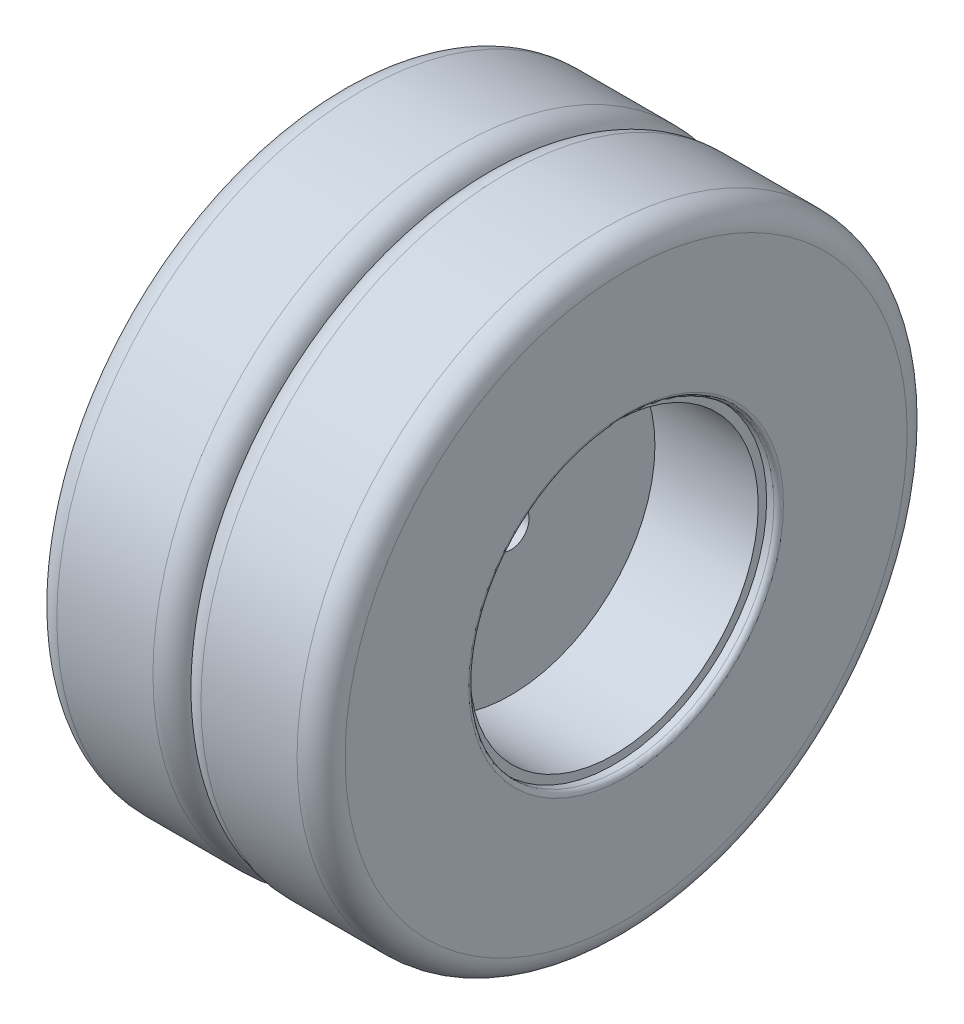
ISO-10303-21;
HEADER;
FILE_DESCRIPTION(('STEP AP214'),'2;1');
FILE_NAME('part.step','',(''),(''),'','','');
FILE_SCHEMA(('AUTOMOTIVE_DESIGN { 1 0 10303 214 1 1 1 1 }'));
ENDSEC;
DATA;
#1=APPLICATION_CONTEXT('core data for automotive mechanical design processes');
#2=APPLICATION_PROTOCOL_DEFINITION('international standard','automotive_design',2000,#1);
#3=PRODUCT_CONTEXT('',#1,'mechanical');
#4=PRODUCT('Part','Part','',(#3));
#5=PRODUCT_RELATED_PRODUCT_CATEGORY('part','',(#4));
#6=PRODUCT_DEFINITION_FORMATION('','',#4);
#7=PRODUCT_DEFINITION_CONTEXT('part definition',#1,'design');
#8=PRODUCT_DEFINITION('design','',#6,#7);
#9=PRODUCT_DEFINITION_SHAPE('','',#8);
#10=(LENGTH_UNIT() NAMED_UNIT(*) SI_UNIT(.MILLI.,.METRE.));
#11=(NAMED_UNIT(*) PLANE_ANGLE_UNIT() SI_UNIT($,.RADIAN.));
#12=(NAMED_UNIT(*) SI_UNIT($,.STERADIAN.) SOLID_ANGLE_UNIT());
#13=UNCERTAINTY_MEASURE_WITH_UNIT(LENGTH_MEASURE(1.E-05),#10,'distance_accuracy_value','');
#14=(GEOMETRIC_REPRESENTATION_CONTEXT(3) GLOBAL_UNCERTAINTY_ASSIGNED_CONTEXT((#13)) GLOBAL_UNIT_ASSIGNED_CONTEXT((#10,
#11,#12)) REPRESENTATION_CONTEXT('',''));
#15=CARTESIAN_POINT('',(0.,0.,0.));
#16=DIRECTION('',(0.,0.,1.));
#17=DIRECTION('',(1.,0.,0.));
#18=AXIS2_PLACEMENT_3D('',#15,#16,#17);
#19=CARTESIAN_POINT('',(-12.,0.,0.));
#20=DIRECTION('',(-1.,0.,0.));
#21=DIRECTION('',(0.,0.,-1.));
#22=AXIS2_PLACEMENT_3D('',#19,#20,#21);
#23=PLANE('',#22);
#24=CARTESIAN_POINT('',(-12.,0.,0.));
#25=DIRECTION('',(1.,0.,0.));
#26=DIRECTION('',(0.,0.,-1.));
#27=AXIS2_PLACEMENT_3D('',#24,#25,#26);
#28=CIRCLE('',#27,7.625);
#29=CARTESIAN_POINT('',(-12.,0.,-7.625));
#30=VERTEX_POINT('',#29);
#31=EDGE_CURVE('E81',#30,#30,#28,.T.);
#32=ORIENTED_EDGE('',*,*,#31,.T.);
#33=EDGE_LOOP('',(#32));
#34=FACE_BOUND('',#33,.T.);
#35=CARTESIAN_POINT('',(-12.,0.,0.));
#36=DIRECTION('',(1.,0.,0.));
#37=DIRECTION('',(0.,0.,-1.));
#38=AXIS2_PLACEMENT_3D('',#35,#36,#37);
#39=CIRCLE('',#38,60.);
#40=CARTESIAN_POINT('',(-12.,0.,-60.));
#41=VERTEX_POINT('',#40);
#42=EDGE_CURVE('E77',#41,#41,#39,.F.);
#43=ORIENTED_EDGE('',*,*,#42,.T.);
#44=EDGE_LOOP('',(#43));
#45=FACE_BOUND('',#44,.T.);
#46=ADVANCED_FACE('F45',(#34,#45),#23,.T.);
#47=CARTESIAN_POINT('',(-5.,0.,0.));
#48=DIRECTION('',(-1.,0.,0.));
#49=DIRECTION('',(0.,0.,-1.));
#50=AXIS2_PLACEMENT_3D('',#47,#48,#49);
#51=PLANE('',#50);
#52=CARTESIAN_POINT('',(-5.,0.,0.));
#53=DIRECTION('',(1.,0.,0.));
#54=DIRECTION('',(0.,0.,-1.));
#55=AXIS2_PLACEMENT_3D('',#52,#53,#54);
#56=CIRCLE('',#55,63.5);
#57=CARTESIAN_POINT('',(-5.,0.,-63.5));
#58=VERTEX_POINT('',#57);
#59=EDGE_CURVE('E78',#58,#58,#56,.T.);
#60=ORIENTED_EDGE('',*,*,#59,.T.);
#61=EDGE_LOOP('',(#60));
#62=FACE_BOUND('',#61,.T.);
#63=CARTESIAN_POINT('',(-5.,0.,0.));
#64=DIRECTION('',(1.,0.,0.));
#65=DIRECTION('',(0.,0.,-1.));
#66=AXIS2_PLACEMENT_3D('',#63,#64,#65);
#67=CIRCLE('',#66,7.625);
#68=CARTESIAN_POINT('',(-5.,0.,-7.625));
#69=VERTEX_POINT('',#68);
#70=EDGE_CURVE('E82',#69,#69,#67,.T.);
#71=ORIENTED_EDGE('',*,*,#70,.F.);
#72=EDGE_LOOP('',(#71));
#73=FACE_BOUND('',#72,.T.);
#74=ADVANCED_FACE('F122',(#62,#73),#51,.F.);
#75=CARTESIAN_POINT('',(-12.,0.,0.));
#76=DIRECTION('',(1.,0.,0.));
#77=DIRECTION('',(0.,0.,1.));
#78=AXIS2_PLACEMENT_3D('',#75,#76,#77);
#79=CYLINDRICAL_SURFACE('',#78,7.625);
#80=ORIENTED_EDGE('',*,*,#31,.F.);
#81=EDGE_LOOP('',(#80));
#82=FACE_BOUND('',#81,.T.);
#83=ORIENTED_EDGE('',*,*,#70,.T.);
#84=EDGE_LOOP('',(#83));
#85=FACE_BOUND('',#84,.T.);
#86=ADVANCED_FACE('F128',(#82,#85),#79,.F.);
#87=CARTESIAN_POINT('',(-55.,0.,0.));
#88=DIRECTION('',(-1.,0.,0.));
#89=DIRECTION('',(0.,0.,-1.));
#90=AXIS2_PLACEMENT_3D('',#87,#88,#89);
#91=PLANE('',#90);
#92=CARTESIAN_POINT('',(-55.,0.,0.));
#93=DIRECTION('',(1.,0.,0.));
#94=DIRECTION('',(0.,0.,-1.));
#95=AXIS2_PLACEMENT_3D('',#92,#93,#94);
#96=CIRCLE('',#95,63.5);
#97=CARTESIAN_POINT('',(-55.,0.,-63.5));
#98=VERTEX_POINT('',#97);
#99=EDGE_CURVE('E92',#98,#98,#96,.F.);
#100=ORIENTED_EDGE('',*,*,#99,.T.);
#101=EDGE_LOOP('',(#100));
#102=FACE_BOUND('',#101,.T.);
#103=CARTESIAN_POINT('',(-55.,0.,0.));
#104=DIRECTION('',(1.,0.,0.));
#105=DIRECTION('',(0.,0.,-1.));
#106=AXIS2_PLACEMENT_3D('',#103,#104,#105);
#107=CIRCLE('',#106,60.);
#108=CARTESIAN_POINT('',(-55.,0.,-60.));
#109=VERTEX_POINT('',#108);
#110=EDGE_CURVE('E85',#109,#109,#107,.T.);
#111=ORIENTED_EDGE('',*,*,#110,.T.);
#112=EDGE_LOOP('',(#111));
#113=FACE_BOUND('',#112,.T.);
#114=ADVANCED_FACE('F96',(#102,#113),#91,.T.);
#115=CARTESIAN_POINT('',(-55.,0.,0.));
#116=DIRECTION('',(1.,0.,0.));
#117=DIRECTION('',(0.,0.,1.));
#118=AXIS2_PLACEMENT_3D('',#115,#116,#117);
#119=CYLINDRICAL_SURFACE('',#118,60.);
#120=ORIENTED_EDGE('',*,*,#42,.F.);
#121=EDGE_LOOP('',(#120));
#122=FACE_BOUND('',#121,.T.);
#123=ORIENTED_EDGE('',*,*,#110,.F.);
#124=EDGE_LOOP('',(#123));
#125=FACE_BOUND('',#124,.T.);
#126=ADVANCED_FACE('F119',(#122,#125),#119,.F.);
#127=CARTESIAN_POINT('',(-60.,0.,0.));
#128=DIRECTION('',(1.,0.,0.));
#129=DIRECTION('',(0.,0.,1.));
#130=AXIS2_PLACEMENT_3D('',#127,#128,#129);
#131=CYLINDRICAL_SURFACE('',#130,63.5);
#132=CARTESIAN_POINT('',(-2.,0.,0.));
#133=DIRECTION('',(1.,0.,0.));
#134=DIRECTION('',(0.,0.,-1.));
#135=AXIS2_PLACEMENT_3D('',#132,#133,#134);
#136=CIRCLE('',#135,63.5);
#137=CARTESIAN_POINT('',(-2.,0.,-63.5));
#138=VERTEX_POINT('',#137);
#139=EDGE_CURVE('E56',#138,#138,#136,.F.);
#140=ORIENTED_EDGE('',*,*,#139,.F.);
#141=EDGE_LOOP('',(#140));
#142=FACE_BOUND('',#141,.T.);
#143=ORIENTED_EDGE('',*,*,#59,.F.);
#144=EDGE_LOOP('',(#143));
#145=FACE_BOUND('',#144,.T.);
#146=ADVANCED_FACE('F105',(#142,#145),#131,.F.);
#147=CARTESIAN_POINT('',(-60.,0.,0.));
#148=DIRECTION('',(-1.,0.,0.));
#149=DIRECTION('',(0.,0.,-1.));
#150=AXIS2_PLACEMENT_3D('',#147,#148,#149);
#151=PLANE('',#150);
#152=CARTESIAN_POINT('',(-60.,0.,0.));
#153=DIRECTION('',(1.,0.,0.));
#154=DIRECTION('',(0.,0.,-1.));
#155=AXIS2_PLACEMENT_3D('',#152,#153,#154);
#156=CIRCLE('',#155,65.5);
#157=CARTESIAN_POINT('',(-60.,0.,-65.5));
#158=VERTEX_POINT('',#157);
#159=EDGE_CURVE('E11',#158,#158,#156,.F.);
#160=ORIENTED_EDGE('',*,*,#159,.F.);
#161=EDGE_LOOP('',(#160));
#162=FACE_BOUND('',#161,.T.);
#163=CARTESIAN_POINT('',(-60.,0.,0.));
#164=DIRECTION('',(1.,0.,0.));
#165=DIRECTION('',(0.,0.,-1.));
#166=AXIS2_PLACEMENT_3D('',#163,#164,#165);
#167=CIRCLE('',#166,117.);
#168=CARTESIAN_POINT('',(-60.,0.,-117.));
#169=VERTEX_POINT('',#168);
#170=EDGE_CURVE('E65',#169,#169,#167,.T.);
#171=ORIENTED_EDGE('',*,*,#170,.F.);
#172=EDGE_LOOP('',(#171));
#173=FACE_BOUND('',#172,.T.);
#174=ADVANCED_FACE('F118',(#162,#173),#151,.T.);
#175=CARTESIAN_POINT('',(0.,0.,0.));
#176=DIRECTION('',(-1.,0.,0.));
#177=DIRECTION('',(0.,0.,-1.));
#178=AXIS2_PLACEMENT_3D('',#175,#176,#177);
#179=PLANE('',#178);
#180=CARTESIAN_POINT('',(0.,0.,0.));
#181=DIRECTION('',(1.,0.,0.));
#182=DIRECTION('',(0.,0.,-1.));
#183=AXIS2_PLACEMENT_3D('',#180,#181,#182);
#184=CIRCLE('',#183,65.5);
#185=CARTESIAN_POINT('',(0.,0.,-65.5));
#186=VERTEX_POINT('',#185);
#187=EDGE_CURVE('E60',#186,#186,#184,.T.);
#188=ORIENTED_EDGE('',*,*,#187,.F.);
#189=EDGE_LOOP('',(#188));
#190=FACE_BOUND('',#189,.T.);
#191=CARTESIAN_POINT('',(0.,0.,0.));
#192=DIRECTION('',(1.,0.,0.));
#193=DIRECTION('',(0.,0.,-1.));
#194=AXIS2_PLACEMENT_3D('',#191,#192,#193);
#195=CIRCLE('',#194,117.);
#196=CARTESIAN_POINT('',(0.,0.,-117.));
#197=VERTEX_POINT('',#196);
#198=EDGE_CURVE('E68',#197,#197,#195,.F.);
#199=ORIENTED_EDGE('',*,*,#198,.F.);
#200=EDGE_LOOP('',(#199));
#201=FACE_BOUND('',#200,.T.);
#202=ADVANCED_FACE('F113',(#190,#201),#179,.F.);
#203=CARTESIAN_POINT('',(-60.,0.,0.));
#204=DIRECTION('',(1.,0.,0.));
#205=DIRECTION('',(0.,0.,1.));
#206=AXIS2_PLACEMENT_3D('',#203,#204,#205);
#207=CYLINDRICAL_SURFACE('',#206,127.);
#208=CARTESIAN_POINT('',(-10.,0.,0.));
#209=DIRECTION('',(1.,0.,0.));
#210=DIRECTION('',(0.,0.,-1.));
#211=AXIS2_PLACEMENT_3D('',#208,#209,#210);
#212=CIRCLE('',#211,127.);
#213=CARTESIAN_POINT('',(-10.,0.,-127.));
#214=VERTEX_POINT('',#213);
#215=EDGE_CURVE('E71',#214,#214,#212,.T.);
#216=ORIENTED_EDGE('',*,*,#215,.F.);
#217=EDGE_LOOP('',(#216));
#218=FACE_BOUND('',#217,.T.);
#219=CARTESIAN_POINT('',(-50.,0.,0.));
#220=DIRECTION('',(1.,0.,0.));
#221=DIRECTION('',(0.,0.,-1.));
#222=AXIS2_PLACEMENT_3D('',#219,#220,#221);
#223=CIRCLE('',#222,127.);
#224=CARTESIAN_POINT('',(-50.,0.,-127.));
#225=VERTEX_POINT('',#224);
#226=EDGE_CURVE('E74',#225,#225,#223,.F.);
#227=ORIENTED_EDGE('',*,*,#226,.F.);
#228=EDGE_LOOP('',(#227));
#229=FACE_BOUND('',#228,.T.);
#230=ADVANCED_FACE('F102',(#218,#229),#207,.T.);
#231=CARTESIAN_POINT('',(-58.,0.,0.));
#232=DIRECTION('',(1.,0.,0.));
#233=DIRECTION('',(0.,0.,-1.));
#234=AXIS2_PLACEMENT_3D('',#231,#232,#233);
#235=CIRCLE('',#234,63.5);
#236=CARTESIAN_POINT('',(-58.,0.,-63.5));
#237=VERTEX_POINT('',#236);
#238=EDGE_CURVE('E52',#237,#237,#235,.T.);
#239=ORIENTED_EDGE('',*,*,#238,.F.);
#240=EDGE_LOOP('',(#239));
#241=FACE_BOUND('',#240,.T.);
#242=ORIENTED_EDGE('',*,*,#99,.F.);
#243=EDGE_LOOP('',(#242));
#244=FACE_BOUND('',#243,.T.);
#245=ADVANCED_FACE('F99',(#241,#244),#131,.F.);
#246=CARTESIAN_POINT('',(-10.,0.,0.));
#247=DIRECTION('',(-1.,0.,0.));
#248=DIRECTION('',(0.,0.,-1.));
#249=AXIS2_PLACEMENT_3D('',#246,#247,#248);
#250=TOROIDAL_SURFACE('',#249,117.,10.);
#251=ORIENTED_EDGE('',*,*,#198,.T.);
#252=EDGE_LOOP('',(#251));
#253=FACE_BOUND('',#252,.T.);
#254=ORIENTED_EDGE('',*,*,#215,.T.);
#255=EDGE_LOOP('',(#254));
#256=FACE_BOUND('',#255,.T.);
#257=ADVANCED_FACE('F101',(#253,#256),#250,.T.);
#258=CARTESIAN_POINT('',(-50.,0.,0.));
#259=DIRECTION('',(-1.,0.,0.));
#260=DIRECTION('',(0.,0.,-1.));
#261=AXIS2_PLACEMENT_3D('',#258,#259,#260);
#262=TOROIDAL_SURFACE('',#261,117.,10.);
#263=ORIENTED_EDGE('',*,*,#226,.T.);
#264=EDGE_LOOP('',(#263));
#265=FACE_BOUND('',#264,.T.);
#266=ORIENTED_EDGE('',*,*,#170,.T.);
#267=EDGE_LOOP('',(#266));
#268=FACE_BOUND('',#267,.T.);
#269=ADVANCED_FACE('F110',(#265,#268),#262,.T.);
#270=CARTESIAN_POINT('',(-2.,0.,0.));
#271=DIRECTION('',(-1.,0.,0.));
#272=DIRECTION('',(0.,0.,-1.));
#273=AXIS2_PLACEMENT_3D('',#270,#271,#272);
#274=TOROIDAL_SURFACE('',#273,65.5,2.);
#275=ORIENTED_EDGE('',*,*,#139,.T.);
#276=EDGE_LOOP('',(#275));
#277=FACE_BOUND('',#276,.T.);
#278=ORIENTED_EDGE('',*,*,#187,.T.);
#279=EDGE_LOOP('',(#278));
#280=FACE_BOUND('',#279,.T.);
#281=ADVANCED_FACE('F136',(#277,#280),#274,.T.);
#282=CARTESIAN_POINT('',(-58.,0.,0.));
#283=DIRECTION('',(-1.,0.,0.));
#284=DIRECTION('',(0.,0.,-1.));
#285=AXIS2_PLACEMENT_3D('',#282,#283,#284);
#286=TOROIDAL_SURFACE('',#285,65.5,2.);
#287=ORIENTED_EDGE('',*,*,#159,.T.);
#288=EDGE_LOOP('',(#287));
#289=FACE_BOUND('',#288,.T.);
#290=ORIENTED_EDGE('',*,*,#238,.T.);
#291=EDGE_LOOP('',(#290));
#292=FACE_BOUND('',#291,.T.);
#293=ADVANCED_FACE('F47',(#289,#292),#286,.T.);
#294=CLOSED_SHELL('',(#46,#74,#86,#114,#126,#146,#174,#202,#230,#245,#257,#269,#281,#293));
#295=MANIFOLD_SOLID_BREP('B2_NOT_SHOWN',#294);
#296=CARTESIAN_POINT('',(12.,0.,0.));
#297=DIRECTION('',(1.,0.,0.));
#298=DIRECTION('',(0.,0.,-1.));
#299=AXIS2_PLACEMENT_3D('',#296,#297,#298);
#300=PLANE('',#299);
#301=CARTESIAN_POINT('',(12.,0.,0.));
#302=DIRECTION('',(1.,0.,0.));
#303=DIRECTION('',(0.,0.,-1.));
#304=AXIS2_PLACEMENT_3D('',#301,#302,#303);
#305=CIRCLE('',#304,7.625);
#306=CARTESIAN_POINT('',(12.,0.,-7.625));
#307=VERTEX_POINT('',#306);
#308=EDGE_CURVE('E291',#307,#307,#305,.T.);
#309=ORIENTED_EDGE('',*,*,#308,.F.);
#310=EDGE_LOOP('',(#309));
#311=FACE_BOUND('',#310,.T.);
#312=CARTESIAN_POINT('',(12.,0.,0.));
#313=DIRECTION('',(1.,0.,0.));
#314=DIRECTION('',(0.,0.,-1.));
#315=AXIS2_PLACEMENT_3D('',#312,#313,#314);
#316=CIRCLE('',#315,60.);
#317=CARTESIAN_POINT('',(12.,0.,-60.));
#318=VERTEX_POINT('',#317);
#319=EDGE_CURVE('E287',#318,#318,#316,.F.);
#320=ORIENTED_EDGE('',*,*,#319,.F.);
#321=EDGE_LOOP('',(#320));
#322=FACE_BOUND('',#321,.T.);
#323=ADVANCED_FACE('F255',(#311,#322),#300,.T.);
#324=CARTESIAN_POINT('',(5.,0.,0.));
#325=DIRECTION('',(1.,0.,0.));
#326=DIRECTION('',(0.,0.,-1.));
#327=AXIS2_PLACEMENT_3D('',#324,#325,#326);
#328=PLANE('',#327);
#329=CARTESIAN_POINT('',(5.,0.,0.));
#330=DIRECTION('',(1.,0.,0.));
#331=DIRECTION('',(0.,0.,-1.));
#332=AXIS2_PLACEMENT_3D('',#329,#330,#331);
#333=CIRCLE('',#332,63.5);
#334=CARTESIAN_POINT('',(5.,0.,-63.5));
#335=VERTEX_POINT('',#334);
#336=EDGE_CURVE('E288',#335,#335,#333,.T.);
#337=ORIENTED_EDGE('',*,*,#336,.F.);
#338=EDGE_LOOP('',(#337));
#339=FACE_BOUND('',#338,.T.);
#340=CARTESIAN_POINT('',(5.,0.,0.));
#341=DIRECTION('',(1.,0.,0.));
#342=DIRECTION('',(0.,0.,-1.));
#343=AXIS2_PLACEMENT_3D('',#340,#341,#342);
#344=CIRCLE('',#343,7.625);
#345=CARTESIAN_POINT('',(5.,0.,-7.625));
#346=VERTEX_POINT('',#345);
#347=EDGE_CURVE('E292',#346,#346,#344,.T.);
#348=ORIENTED_EDGE('',*,*,#347,.T.);
#349=EDGE_LOOP('',(#348));
#350=FACE_BOUND('',#349,.T.);
#351=ADVANCED_FACE('F328',(#339,#350),#328,.F.);
#352=CARTESIAN_POINT('',(12.,0.,0.));
#353=DIRECTION('',(-1.,0.,0.));
#354=DIRECTION('',(0.,0.,1.));
#355=AXIS2_PLACEMENT_3D('',#352,#353,#354);
#356=CYLINDRICAL_SURFACE('',#355,7.625);
#357=ORIENTED_EDGE('',*,*,#308,.T.);
#358=EDGE_LOOP('',(#357));
#359=FACE_BOUND('',#358,.T.);
#360=ORIENTED_EDGE('',*,*,#347,.F.);
#361=EDGE_LOOP('',(#360));
#362=FACE_BOUND('',#361,.T.);
#363=ADVANCED_FACE('F312',(#359,#362),#356,.F.);
#364=CARTESIAN_POINT('',(55.,0.,0.));
#365=DIRECTION('',(1.,0.,0.));
#366=DIRECTION('',(0.,0.,-1.));
#367=AXIS2_PLACEMENT_3D('',#364,#365,#366);
#368=PLANE('',#367);
#369=CARTESIAN_POINT('',(55.,0.,0.));
#370=DIRECTION('',(1.,0.,0.));
#371=DIRECTION('',(0.,0.,-1.));
#372=AXIS2_PLACEMENT_3D('',#369,#370,#371);
#373=CIRCLE('',#372,63.5);
#374=CARTESIAN_POINT('',(55.,0.,-63.5));
#375=VERTEX_POINT('',#374);
#376=EDGE_CURVE('E302',#375,#375,#373,.F.);
#377=ORIENTED_EDGE('',*,*,#376,.F.);
#378=EDGE_LOOP('',(#377));
#379=FACE_BOUND('',#378,.T.);
#380=CARTESIAN_POINT('',(55.,0.,0.));
#381=DIRECTION('',(1.,0.,0.));
#382=DIRECTION('',(0.,0.,-1.));
#383=AXIS2_PLACEMENT_3D('',#380,#381,#382);
#384=CIRCLE('',#383,60.);
#385=CARTESIAN_POINT('',(55.,0.,-60.));
#386=VERTEX_POINT('',#385);
#387=EDGE_CURVE('E295',#386,#386,#384,.T.);
#388=ORIENTED_EDGE('',*,*,#387,.F.);
#389=EDGE_LOOP('',(#388));
#390=FACE_BOUND('',#389,.T.);
#391=ADVANCED_FACE('F308',(#379,#390),#368,.T.);
#392=CARTESIAN_POINT('',(55.,0.,0.));
#393=DIRECTION('',(-1.,0.,0.));
#394=DIRECTION('',(0.,0.,1.));
#395=AXIS2_PLACEMENT_3D('',#392,#393,#394);
#396=CYLINDRICAL_SURFACE('',#395,60.);
#397=ORIENTED_EDGE('',*,*,#319,.T.);
#398=EDGE_LOOP('',(#397));
#399=FACE_BOUND('',#398,.T.);
#400=ORIENTED_EDGE('',*,*,#387,.T.);
#401=EDGE_LOOP('',(#400));
#402=FACE_BOUND('',#401,.T.);
#403=ADVANCED_FACE('F311',(#399,#402),#396,.F.);
#404=CARTESIAN_POINT('',(60.,0.,0.));
#405=DIRECTION('',(-1.,0.,0.));
#406=DIRECTION('',(0.,0.,1.));
#407=AXIS2_PLACEMENT_3D('',#404,#405,#406);
#408=CYLINDRICAL_SURFACE('',#407,63.5);
#409=CARTESIAN_POINT('',(2.,0.,0.));
#410=DIRECTION('',(1.,0.,0.));
#411=DIRECTION('',(0.,0.,-1.));
#412=AXIS2_PLACEMENT_3D('',#409,#410,#411);
#413=CIRCLE('',#412,63.5);
#414=CARTESIAN_POINT('',(2.,0.,-63.5));
#415=VERTEX_POINT('',#414);
#416=EDGE_CURVE('E266',#415,#415,#413,.F.);
#417=ORIENTED_EDGE('',*,*,#416,.T.);
#418=EDGE_LOOP('',(#417));
#419=FACE_BOUND('',#418,.T.);
#420=ORIENTED_EDGE('',*,*,#336,.T.);
#421=EDGE_LOOP('',(#420));
#422=FACE_BOUND('',#421,.T.);
#423=ADVANCED_FACE('F317',(#419,#422),#408,.F.);
#424=CARTESIAN_POINT('',(60.,0.,0.));
#425=DIRECTION('',(1.,0.,0.));
#426=DIRECTION('',(0.,0.,-1.));
#427=AXIS2_PLACEMENT_3D('',#424,#425,#426);
#428=PLANE('',#427);
#429=CARTESIAN_POINT('',(60.,0.,0.));
#430=DIRECTION('',(1.,0.,0.));
#431=DIRECTION('',(0.,0.,-1.));
#432=AXIS2_PLACEMENT_3D('',#429,#430,#431);
#433=CIRCLE('',#432,65.5);
#434=CARTESIAN_POINT('',(60.,0.,-65.5));
#435=VERTEX_POINT('',#434);
#436=EDGE_CURVE('E44',#435,#435,#433,.F.);
#437=ORIENTED_EDGE('',*,*,#436,.T.);
#438=EDGE_LOOP('',(#437));
#439=FACE_BOUND('',#438,.T.);
#440=CARTESIAN_POINT('',(60.,0.,0.));
#441=DIRECTION('',(1.,0.,0.));
#442=DIRECTION('',(0.,0.,-1.));
#443=AXIS2_PLACEMENT_3D('',#440,#441,#442);
#444=CIRCLE('',#443,117.);
#445=CARTESIAN_POINT('',(60.,0.,-117.));
#446=VERTEX_POINT('',#445);
#447=EDGE_CURVE('E275',#446,#446,#444,.T.);
#448=ORIENTED_EDGE('',*,*,#447,.T.);
#449=EDGE_LOOP('',(#448));
#450=FACE_BOUND('',#449,.T.);
#451=ADVANCED_FACE('F323',(#439,#450),#428,.T.);
#452=CARTESIAN_POINT('',(0.,0.,0.));
#453=DIRECTION('',(1.,0.,0.));
#454=DIRECTION('',(0.,0.,-1.));
#455=AXIS2_PLACEMENT_3D('',#452,#453,#454);
#456=PLANE('',#455);
#457=CARTESIAN_POINT('',(0.,0.,0.));
#458=DIRECTION('',(1.,0.,0.));
#459=DIRECTION('',(0.,0.,-1.));
#460=AXIS2_PLACEMENT_3D('',#457,#458,#459);
#461=CIRCLE('',#460,65.5);
#462=CARTESIAN_POINT('',(0.,0.,-65.5));
#463=VERTEX_POINT('',#462);
#464=EDGE_CURVE('E270',#463,#463,#461,.T.);
#465=ORIENTED_EDGE('',*,*,#464,.T.);
#466=EDGE_LOOP('',(#465));
#467=FACE_BOUND('',#466,.T.);
#468=CARTESIAN_POINT('',(0.,0.,0.));
#469=DIRECTION('',(1.,0.,0.));
#470=DIRECTION('',(0.,0.,-1.));
#471=AXIS2_PLACEMENT_3D('',#468,#469,#470);
#472=CIRCLE('',#471,117.);
#473=CARTESIAN_POINT('',(0.,0.,-117.));
#474=VERTEX_POINT('',#473);
#475=EDGE_CURVE('E278',#474,#474,#472,.F.);
#476=ORIENTED_EDGE('',*,*,#475,.T.);
#477=EDGE_LOOP('',(#476));
#478=FACE_BOUND('',#477,.T.);
#479=ADVANCED_FACE('F358',(#467,#478),#456,.F.);
#480=CARTESIAN_POINT('',(60.,0.,0.));
#481=DIRECTION('',(-1.,0.,0.));
#482=DIRECTION('',(0.,0.,1.));
#483=AXIS2_PLACEMENT_3D('',#480,#481,#482);
#484=CYLINDRICAL_SURFACE('',#483,127.);
#485=CARTESIAN_POINT('',(10.,0.,0.));
#486=DIRECTION('',(1.,0.,0.));
#487=DIRECTION('',(0.,0.,-1.));
#488=AXIS2_PLACEMENT_3D('',#485,#486,#487);
#489=CIRCLE('',#488,127.);
#490=CARTESIAN_POINT('',(10.,0.,-127.));
#491=VERTEX_POINT('',#490);
#492=EDGE_CURVE('E281',#491,#491,#489,.T.);
#493=ORIENTED_EDGE('',*,*,#492,.T.);
#494=EDGE_LOOP('',(#493));
#495=FACE_BOUND('',#494,.T.);
#496=CARTESIAN_POINT('',(50.,0.,0.));
#497=DIRECTION('',(1.,0.,0.));
#498=DIRECTION('',(0.,0.,-1.));
#499=AXIS2_PLACEMENT_3D('',#496,#497,#498);
#500=CIRCLE('',#499,127.);
#501=CARTESIAN_POINT('',(50.,0.,-127.));
#502=VERTEX_POINT('',#501);
#503=EDGE_CURVE('E284',#502,#502,#500,.F.);
#504=ORIENTED_EDGE('',*,*,#503,.T.);
#505=EDGE_LOOP('',(#504));
#506=FACE_BOUND('',#505,.T.);
#507=ADVANCED_FACE('F361',(#495,#506),#484,.T.);
#508=CARTESIAN_POINT('',(58.,0.,0.));
#509=DIRECTION('',(1.,0.,0.));
#510=DIRECTION('',(0.,0.,-1.));
#511=AXIS2_PLACEMENT_3D('',#508,#509,#510);
#512=CIRCLE('',#511,63.5);
#513=CARTESIAN_POINT('',(58.,0.,-63.5));
#514=VERTEX_POINT('',#513);
#515=EDGE_CURVE('E262',#514,#514,#512,.T.);
#516=ORIENTED_EDGE('',*,*,#515,.T.);
#517=EDGE_LOOP('',(#516));
#518=FACE_BOUND('',#517,.T.);
#519=ORIENTED_EDGE('',*,*,#376,.T.);
#520=EDGE_LOOP('',(#519));
#521=FACE_BOUND('',#520,.T.);
#522=ADVANCED_FACE('F306',(#518,#521),#408,.F.);
#523=CARTESIAN_POINT('',(10.,0.,0.));
#524=DIRECTION('',(1.,0.,0.));
#525=DIRECTION('',(0.,0.,-1.));
#526=AXIS2_PLACEMENT_3D('',#523,#524,#525);
#527=TOROIDAL_SURFACE('',#526,117.,10.);
#528=ORIENTED_EDGE('',*,*,#475,.F.);
#529=EDGE_LOOP('',(#528));
#530=FACE_BOUND('',#529,.T.);
#531=ORIENTED_EDGE('',*,*,#492,.F.);
#532=EDGE_LOOP('',(#531));
#533=FACE_BOUND('',#532,.T.);
#534=ADVANCED_FACE('F340',(#530,#533),#527,.T.);
#535=CARTESIAN_POINT('',(50.,0.,0.));
#536=DIRECTION('',(1.,0.,0.));
#537=DIRECTION('',(0.,0.,-1.));
#538=AXIS2_PLACEMENT_3D('',#535,#536,#537);
#539=TOROIDAL_SURFACE('',#538,117.,10.);
#540=ORIENTED_EDGE('',*,*,#503,.F.);
#541=EDGE_LOOP('',(#540));
#542=FACE_BOUND('',#541,.T.);
#543=ORIENTED_EDGE('',*,*,#447,.F.);
#544=EDGE_LOOP('',(#543));
#545=FACE_BOUND('',#544,.T.);
#546=ADVANCED_FACE('F343',(#542,#545),#539,.T.);
#547=CARTESIAN_POINT('',(2.,0.,0.));
#548=DIRECTION('',(1.,0.,0.));
#549=DIRECTION('',(0.,0.,-1.));
#550=AXIS2_PLACEMENT_3D('',#547,#548,#549);
#551=TOROIDAL_SURFACE('',#550,65.5,2.);
#552=ORIENTED_EDGE('',*,*,#416,.F.);
#553=EDGE_LOOP('',(#552));
#554=FACE_BOUND('',#553,.T.);
#555=ORIENTED_EDGE('',*,*,#464,.F.);
#556=EDGE_LOOP('',(#555));
#557=FACE_BOUND('',#556,.T.);
#558=ADVANCED_FACE('F346',(#554,#557),#551,.T.);
#559=CARTESIAN_POINT('',(58.,0.,0.));
#560=DIRECTION('',(1.,0.,0.));
#561=DIRECTION('',(0.,0.,-1.));
#562=AXIS2_PLACEMENT_3D('',#559,#560,#561);
#563=TOROIDAL_SURFACE('',#562,65.5,2.);
#564=ORIENTED_EDGE('',*,*,#436,.F.);
#565=EDGE_LOOP('',(#564));
#566=FACE_BOUND('',#565,.T.);
#567=ORIENTED_EDGE('',*,*,#515,.F.);
#568=EDGE_LOOP('',(#567));
#569=FACE_BOUND('',#568,.T.);
#570=ADVANCED_FACE('F257',(#566,#569),#563,.T.);
#571=CLOSED_SHELL('',(#323,#351,#363,#391,#403,#423,#451,#479,#507,#522,#534,#546,#558,#570));
#572=MANIFOLD_SOLID_BREP('B6',#571);
#573=ADVANCED_BREP_SHAPE_REPRESENTATION('',(#18,#295,#572),#14);
#574=SHAPE_DEFINITION_REPRESENTATION(#9,#573);
ENDSEC;
END-ISO-10303-21;
